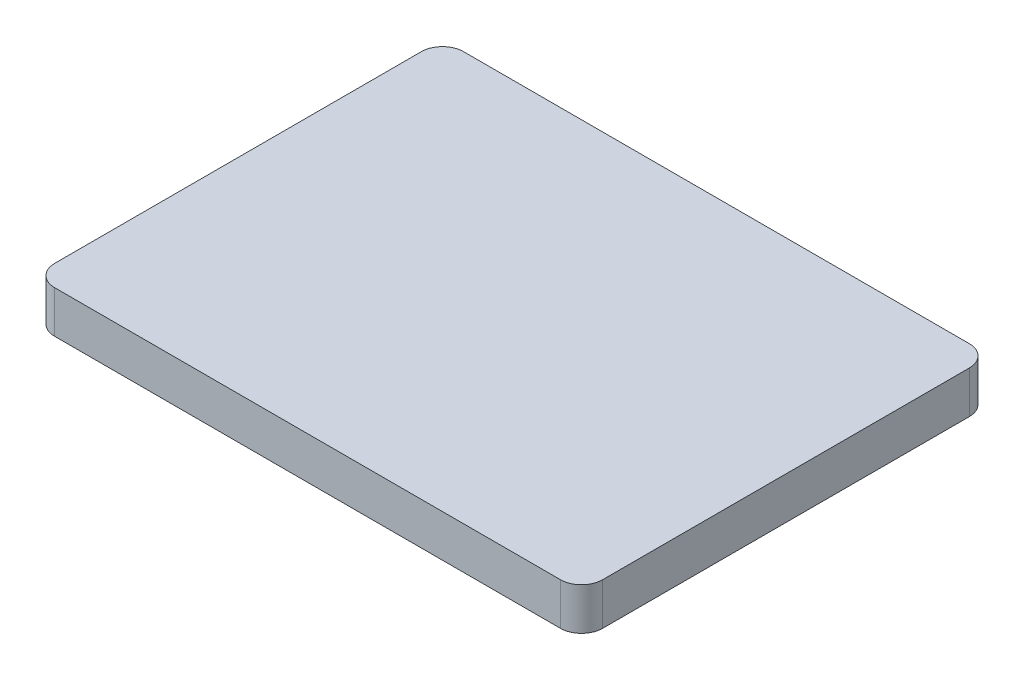
ISO-10303-21;
HEADER;
FILE_DESCRIPTION(('STEP AP214'),'2;1');
FILE_NAME('part.step','',(''),(''),'','','');
FILE_SCHEMA(('AUTOMOTIVE_DESIGN { 1 0 10303 214 1 1 1 1 }'));
ENDSEC;
DATA;
#1=APPLICATION_CONTEXT('core data for automotive mechanical design processes');
#2=APPLICATION_PROTOCOL_DEFINITION('international standard','automotive_design',2000,#1);
#3=PRODUCT_CONTEXT('',#1,'mechanical');
#4=PRODUCT('Part','Part','',(#3));
#5=PRODUCT_RELATED_PRODUCT_CATEGORY('part','',(#4));
#6=PRODUCT_DEFINITION_FORMATION('','',#4);
#7=PRODUCT_DEFINITION_CONTEXT('part definition',#1,'design');
#8=PRODUCT_DEFINITION('design','',#6,#7);
#9=PRODUCT_DEFINITION_SHAPE('','',#8);
#10=(LENGTH_UNIT() NAMED_UNIT(*) SI_UNIT(.MILLI.,.METRE.));
#11=(NAMED_UNIT(*) PLANE_ANGLE_UNIT() SI_UNIT($,.RADIAN.));
#12=(NAMED_UNIT(*) SI_UNIT($,.STERADIAN.) SOLID_ANGLE_UNIT());
#13=UNCERTAINTY_MEASURE_WITH_UNIT(LENGTH_MEASURE(1.E-05),#10,'distance_accuracy_value','');
#14=(GEOMETRIC_REPRESENTATION_CONTEXT(3) GLOBAL_UNCERTAINTY_ASSIGNED_CONTEXT((#13)) GLOBAL_UNIT_ASSIGNED_CONTEXT((#10,
#11,#12)) REPRESENTATION_CONTEXT('',''));
#15=CARTESIAN_POINT('',(0.,0.,0.));
#16=DIRECTION('',(0.,0.,1.));
#17=DIRECTION('',(1.,0.,0.));
#18=AXIS2_PLACEMENT_3D('',#15,#16,#17);
#19=CARTESIAN_POINT('',(65.,-10.,48.5));
#20=DIRECTION('',(1.,0.,0.));
#21=DIRECTION('',(0.,0.,-1.));
#22=AXIS2_PLACEMENT_3D('',#19,#20,#21);
#23=PLANE('',#22);
#24=DIRECTION('',(0.,0.,-1.));
#25=VECTOR('',#24,1.);
#26=CARTESIAN_POINT('',(65.,-10.,48.5));
#27=LINE('',#26,#25);
#28=CARTESIAN_POINT('',(65.,-10.,43.5));
#29=VERTEX_POINT('',#28);
#30=CARTESIAN_POINT('',(65.,-10.,-43.5));
#31=VERTEX_POINT('',#30);
#32=EDGE_CURVE('E163',#29,#31,#27,.T.);
#33=ORIENTED_EDGE('',*,*,#32,.T.);
#34=DIRECTION('',(0.,1.,0.));
#35=VECTOR('',#34,1.);
#36=CARTESIAN_POINT('',(65.,-10.,-43.5));
#37=LINE('',#36,#35);
#38=CARTESIAN_POINT('',(65.,0.,-43.5));
#39=VERTEX_POINT('',#38);
#40=EDGE_CURVE('E11',#31,#39,#37,.T.);
#41=ORIENTED_EDGE('',*,*,#40,.T.);
#42=DIRECTION('',(0.,0.,-1.));
#43=VECTOR('',#42,1.);
#44=CARTESIAN_POINT('',(65.,0.,48.5));
#45=LINE('',#44,#43);
#46=CARTESIAN_POINT('',(65.,0.,43.5));
#47=VERTEX_POINT('',#46);
#48=EDGE_CURVE('E113',#47,#39,#45,.T.);
#49=ORIENTED_EDGE('',*,*,#48,.F.);
#50=DIRECTION('',(0.,1.,0.));
#51=VECTOR('',#50,1.);
#52=CARTESIAN_POINT('',(65.,-10.,43.5));
#53=LINE('',#52,#51);
#54=EDGE_CURVE('E49',#47,#29,#53,.F.);
#55=ORIENTED_EDGE('',*,*,#54,.T.);
#56=EDGE_LOOP('',(#33,#41,#49,#55));
#57=FACE_BOUND('',#56,.T.);
#58=ADVANCED_FACE('F41',(#57),#23,.T.);
#59=CARTESIAN_POINT('',(-65.,-10.,48.5));
#60=DIRECTION('',(0.,0.,1.));
#61=DIRECTION('',(1.,0.,0.));
#62=AXIS2_PLACEMENT_3D('',#59,#60,#61);
#63=PLANE('',#62);
#64=DIRECTION('',(1.,0.,0.));
#65=VECTOR('',#64,1.);
#66=CARTESIAN_POINT('',(-65.,0.,48.5));
#67=LINE('',#66,#65);
#68=CARTESIAN_POINT('',(-60.,0.,48.5));
#69=VERTEX_POINT('',#68);
#70=CARTESIAN_POINT('',(60.,0.,48.5));
#71=VERTEX_POINT('',#70);
#72=EDGE_CURVE('E139',#69,#71,#67,.T.);
#73=ORIENTED_EDGE('',*,*,#72,.F.);
#74=DIRECTION('',(0.,1.,0.));
#75=VECTOR('',#74,1.);
#76=CARTESIAN_POINT('',(-60.,-10.,48.5));
#77=LINE('',#76,#75);
#78=CARTESIAN_POINT('',(-60.,-10.,48.5));
#79=VERTEX_POINT('',#78);
#80=EDGE_CURVE('E63',#69,#79,#77,.F.);
#81=ORIENTED_EDGE('',*,*,#80,.T.);
#82=DIRECTION('',(1.,0.,0.));
#83=VECTOR('',#82,1.);
#84=CARTESIAN_POINT('',(-65.,-10.,48.5));
#85=LINE('',#84,#83);
#86=CARTESIAN_POINT('',(60.,-10.,48.5));
#87=VERTEX_POINT('',#86);
#88=EDGE_CURVE('E133',#79,#87,#85,.T.);
#89=ORIENTED_EDGE('',*,*,#88,.T.);
#90=DIRECTION('',(0.,1.,0.));
#91=VECTOR('',#90,1.);
#92=CARTESIAN_POINT('',(60.,-10.,48.5));
#93=LINE('',#92,#91);
#94=EDGE_CURVE('E157',#87,#71,#93,.T.);
#95=ORIENTED_EDGE('',*,*,#94,.T.);
#96=EDGE_LOOP('',(#73,#81,#89,#95));
#97=FACE_BOUND('',#96,.T.);
#98=ADVANCED_FACE('F171',(#97),#63,.T.);
#99=CARTESIAN_POINT('',(-65.,-10.,48.5));
#100=DIRECTION('',(-1.,0.,0.));
#101=DIRECTION('',(0.,0.,1.));
#102=AXIS2_PLACEMENT_3D('',#99,#100,#101);
#103=PLANE('',#102);
#104=DIRECTION('',(0.,0.,1.));
#105=VECTOR('',#104,1.);
#106=CARTESIAN_POINT('',(-65.,0.,48.5));
#107=LINE('',#106,#105);
#108=CARTESIAN_POINT('',(-65.,0.,-43.5));
#109=VERTEX_POINT('',#108);
#110=CARTESIAN_POINT('',(-65.,0.,43.5));
#111=VERTEX_POINT('',#110);
#112=EDGE_CURVE('E128',#109,#111,#107,.T.);
#113=ORIENTED_EDGE('',*,*,#112,.F.);
#114=DIRECTION('',(0.,1.,0.));
#115=VECTOR('',#114,1.);
#116=CARTESIAN_POINT('',(-65.,-10.,-43.5));
#117=LINE('',#116,#115);
#118=CARTESIAN_POINT('',(-65.,-10.,-43.5));
#119=VERTEX_POINT('',#118);
#120=EDGE_CURVE('E149',#109,#119,#117,.F.);
#121=ORIENTED_EDGE('',*,*,#120,.T.);
#122=DIRECTION('',(0.,0.,1.));
#123=VECTOR('',#122,1.);
#124=CARTESIAN_POINT('',(-65.,-10.,48.5));
#125=LINE('',#124,#123);
#126=CARTESIAN_POINT('',(-65.,-10.,43.5));
#127=VERTEX_POINT('',#126);
#128=EDGE_CURVE('E136',#119,#127,#125,.T.);
#129=ORIENTED_EDGE('',*,*,#128,.T.);
#130=DIRECTION('',(0.,1.,0.));
#131=VECTOR('',#130,1.);
#132=CARTESIAN_POINT('',(-65.,-10.,43.5));
#133=LINE('',#132,#131);
#134=EDGE_CURVE('E146',#127,#111,#133,.T.);
#135=ORIENTED_EDGE('',*,*,#134,.T.);
#136=EDGE_LOOP('',(#113,#121,#129,#135));
#137=FACE_BOUND('',#136,.T.);
#138=ADVANCED_FACE('F183',(#137),#103,.T.);
#139=CARTESIAN_POINT('',(-65.,-10.,-48.5));
#140=DIRECTION('',(0.,0.,-1.));
#141=DIRECTION('',(-1.,0.,0.));
#142=AXIS2_PLACEMENT_3D('',#139,#140,#141);
#143=PLANE('',#142);
#144=DIRECTION('',(-1.,0.,0.));
#145=VECTOR('',#144,1.);
#146=CARTESIAN_POINT('',(-65.,-10.,-48.5));
#147=LINE('',#146,#145);
#148=CARTESIAN_POINT('',(60.,-10.,-48.5));
#149=VERTEX_POINT('',#148);
#150=CARTESIAN_POINT('',(-60.,-10.,-48.5));
#151=VERTEX_POINT('',#150);
#152=EDGE_CURVE('E167',#149,#151,#147,.T.);
#153=ORIENTED_EDGE('',*,*,#152,.T.);
#154=DIRECTION('',(0.,1.,0.));
#155=VECTOR('',#154,1.);
#156=CARTESIAN_POINT('',(-60.,-10.,-48.5));
#157=LINE('',#156,#155);
#158=CARTESIAN_POINT('',(-60.,0.,-48.5));
#159=VERTEX_POINT('',#158);
#160=EDGE_CURVE('E127',#151,#159,#157,.T.);
#161=ORIENTED_EDGE('',*,*,#160,.T.);
#162=DIRECTION('',(-1.,0.,0.));
#163=VECTOR('',#162,1.);
#164=CARTESIAN_POINT('',(-65.,0.,-48.5));
#165=LINE('',#164,#163);
#166=CARTESIAN_POINT('',(60.,0.,-48.5));
#167=VERTEX_POINT('',#166);
#168=EDGE_CURVE('E111',#167,#159,#165,.T.);
#169=ORIENTED_EDGE('',*,*,#168,.F.);
#170=DIRECTION('',(0.,1.,0.));
#171=VECTOR('',#170,1.);
#172=CARTESIAN_POINT('',(60.,-10.,-48.5));
#173=LINE('',#172,#171);
#174=EDGE_CURVE('E124',#167,#149,#173,.F.);
#175=ORIENTED_EDGE('',*,*,#174,.T.);
#176=EDGE_LOOP('',(#153,#161,#169,#175));
#177=FACE_BOUND('',#176,.T.);
#178=ADVANCED_FACE('F123',(#177),#143,.T.);
#179=CARTESIAN_POINT('',(0.,-10.,0.));
#180=DIRECTION('',(0.,-1.,0.));
#181=DIRECTION('',(0.,0.,-1.));
#182=AXIS2_PLACEMENT_3D('',#179,#180,#181);
#183=PLANE('',#182);
#184=ORIENTED_EDGE('',*,*,#128,.F.);
#185=CARTESIAN_POINT('',(-60.,-10.,-43.5));
#186=DIRECTION('',(0.,-1.,0.));
#187=DIRECTION('',(0.,0.,-1.));
#188=AXIS2_PLACEMENT_3D('',#185,#186,#187);
#189=CIRCLE('',#188,5.);
#190=EDGE_CURVE('E155',#119,#151,#189,.T.);
#191=ORIENTED_EDGE('',*,*,#190,.T.);
#192=ORIENTED_EDGE('',*,*,#152,.F.);
#193=CARTESIAN_POINT('',(60.,-10.,-43.5));
#194=DIRECTION('',(0.,-1.,0.));
#195=DIRECTION('',(0.,0.,-1.));
#196=AXIS2_PLACEMENT_3D('',#193,#194,#195);
#197=CIRCLE('',#196,5.);
#198=EDGE_CURVE('E132',#149,#31,#197,.T.);
#199=ORIENTED_EDGE('',*,*,#198,.T.);
#200=ORIENTED_EDGE('',*,*,#32,.F.);
#201=CARTESIAN_POINT('',(60.,-10.,43.5));
#202=DIRECTION('',(0.,-1.,0.));
#203=DIRECTION('',(0.,0.,-1.));
#204=AXIS2_PLACEMENT_3D('',#201,#202,#203);
#205=CIRCLE('',#204,5.);
#206=EDGE_CURVE('E56',#29,#87,#205,.T.);
#207=ORIENTED_EDGE('',*,*,#206,.T.);
#208=ORIENTED_EDGE('',*,*,#88,.F.);
#209=CARTESIAN_POINT('',(-60.,-10.,43.5));
#210=DIRECTION('',(0.,-1.,0.));
#211=DIRECTION('',(0.,0.,-1.));
#212=AXIS2_PLACEMENT_3D('',#209,#210,#211);
#213=CIRCLE('',#212,5.);
#214=EDGE_CURVE('E153',#79,#127,#213,.T.);
#215=ORIENTED_EDGE('',*,*,#214,.T.);
#216=EDGE_LOOP('',(#184,#191,#192,#199,#200,#207,#208,#215));
#217=FACE_BOUND('',#216,.T.);
#218=ADVANCED_FACE('F166',(#217),#183,.T.);
#219=CARTESIAN_POINT('',(0.,0.,0.));
#220=DIRECTION('',(0.,-1.,0.));
#221=DIRECTION('',(0.,0.,-1.));
#222=AXIS2_PLACEMENT_3D('',#219,#220,#221);
#223=PLANE('',#222);
#224=ORIENTED_EDGE('',*,*,#168,.T.);
#225=CARTESIAN_POINT('',(-60.,0.,-43.5));
#226=DIRECTION('',(0.,-1.,0.));
#227=DIRECTION('',(0.,0.,-1.));
#228=AXIS2_PLACEMENT_3D('',#225,#226,#227);
#229=CIRCLE('',#228,5.);
#230=EDGE_CURVE('E144',#159,#109,#229,.F.);
#231=ORIENTED_EDGE('',*,*,#230,.T.);
#232=ORIENTED_EDGE('',*,*,#112,.T.);
#233=CARTESIAN_POINT('',(-60.,0.,43.5));
#234=DIRECTION('',(0.,-1.,0.));
#235=DIRECTION('',(0.,0.,-1.));
#236=AXIS2_PLACEMENT_3D('',#233,#234,#235);
#237=CIRCLE('',#236,5.);
#238=EDGE_CURVE('E117',#111,#69,#237,.F.);
#239=ORIENTED_EDGE('',*,*,#238,.T.);
#240=ORIENTED_EDGE('',*,*,#72,.T.);
#241=CARTESIAN_POINT('',(60.,0.,43.5));
#242=DIRECTION('',(0.,-1.,0.));
#243=DIRECTION('',(0.,0.,-1.));
#244=AXIS2_PLACEMENT_3D('',#241,#242,#243);
#245=CIRCLE('',#244,5.);
#246=EDGE_CURVE('E118',#71,#47,#245,.F.);
#247=ORIENTED_EDGE('',*,*,#246,.T.);
#248=ORIENTED_EDGE('',*,*,#48,.T.);
#249=CARTESIAN_POINT('',(60.,0.,-43.5));
#250=DIRECTION('',(0.,-1.,0.));
#251=DIRECTION('',(0.,0.,-1.));
#252=AXIS2_PLACEMENT_3D('',#249,#250,#251);
#253=CIRCLE('',#252,5.);
#254=EDGE_CURVE('E108',#39,#167,#253,.F.);
#255=ORIENTED_EDGE('',*,*,#254,.T.);
#256=EDGE_LOOP('',(#224,#231,#232,#239,#240,#247,#248,#255));
#257=FACE_BOUND('',#256,.T.);
#258=ADVANCED_FACE('F110',(#257),#223,.F.);
#259=CARTESIAN_POINT('',(-60.,-10.,-43.5));
#260=DIRECTION('',(0.,1.,0.));
#261=DIRECTION('',(0.,0.,1.));
#262=AXIS2_PLACEMENT_3D('',#259,#260,#261);
#263=CYLINDRICAL_SURFACE('',#262,5.);
#264=ORIENTED_EDGE('',*,*,#190,.F.);
#265=ORIENTED_EDGE('',*,*,#120,.F.);
#266=ORIENTED_EDGE('',*,*,#230,.F.);
#267=ORIENTED_EDGE('',*,*,#160,.F.);
#268=EDGE_LOOP('',(#264,#265,#266,#267));
#269=FACE_BOUND('',#268,.T.);
#270=ADVANCED_FACE('F180',(#269),#263,.T.);
#271=CARTESIAN_POINT('',(-60.,-10.,43.5));
#272=DIRECTION('',(0.,1.,0.));
#273=DIRECTION('',(0.,0.,1.));
#274=AXIS2_PLACEMENT_3D('',#271,#272,#273);
#275=CYLINDRICAL_SURFACE('',#274,5.);
#276=ORIENTED_EDGE('',*,*,#214,.F.);
#277=ORIENTED_EDGE('',*,*,#80,.F.);
#278=ORIENTED_EDGE('',*,*,#238,.F.);
#279=ORIENTED_EDGE('',*,*,#134,.F.);
#280=EDGE_LOOP('',(#276,#277,#278,#279));
#281=FACE_BOUND('',#280,.T.);
#282=ADVANCED_FACE('F187',(#281),#275,.T.);
#283=CARTESIAN_POINT('',(60.,-10.,-43.5));
#284=DIRECTION('',(0.,1.,0.));
#285=DIRECTION('',(0.,0.,1.));
#286=AXIS2_PLACEMENT_3D('',#283,#284,#285);
#287=CYLINDRICAL_SURFACE('',#286,5.);
#288=ORIENTED_EDGE('',*,*,#198,.F.);
#289=ORIENTED_EDGE('',*,*,#174,.F.);
#290=ORIENTED_EDGE('',*,*,#254,.F.);
#291=ORIENTED_EDGE('',*,*,#40,.F.);
#292=EDGE_LOOP('',(#288,#289,#290,#291));
#293=FACE_BOUND('',#292,.T.);
#294=ADVANCED_FACE('F131',(#293),#287,.T.);
#295=CARTESIAN_POINT('',(60.,-10.,43.5));
#296=DIRECTION('',(0.,1.,0.));
#297=DIRECTION('',(0.,0.,1.));
#298=AXIS2_PLACEMENT_3D('',#295,#296,#297);
#299=CYLINDRICAL_SURFACE('',#298,5.);
#300=ORIENTED_EDGE('',*,*,#206,.F.);
#301=ORIENTED_EDGE('',*,*,#54,.F.);
#302=ORIENTED_EDGE('',*,*,#246,.F.);
#303=ORIENTED_EDGE('',*,*,#94,.F.);
#304=EDGE_LOOP('',(#300,#301,#302,#303));
#305=FACE_BOUND('',#304,.T.);
#306=ADVANCED_FACE('F43',(#305),#299,.T.);
#307=CLOSED_SHELL('',(#58,#98,#138,#178,#218,#258,#270,#282,#294,#306));
#308=MANIFOLD_SOLID_BREP('B2',#307);
#309=ADVANCED_BREP_SHAPE_REPRESENTATION('',(#18,#308),#14);
#310=SHAPE_DEFINITION_REPRESENTATION(#9,#309);
ENDSEC;
END-ISO-10303-21;
